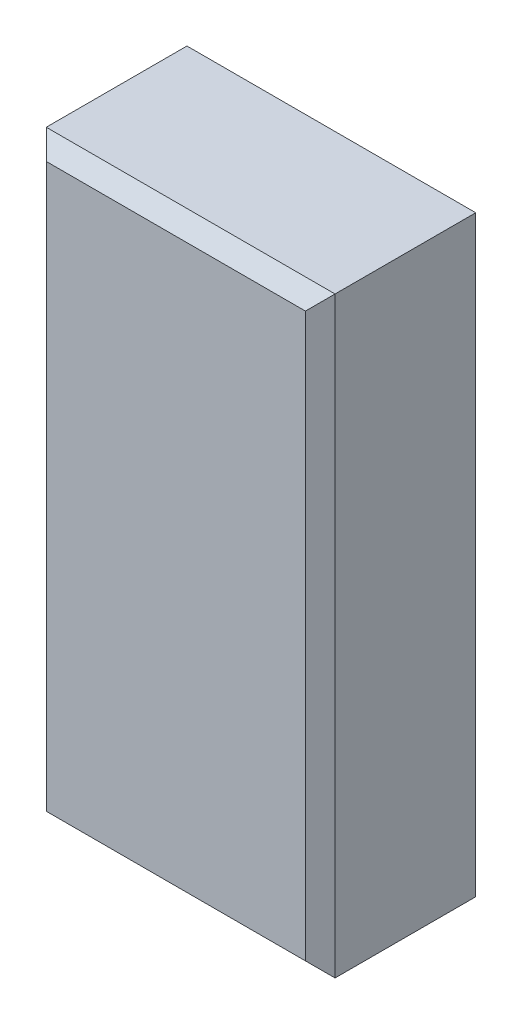
ISO-10303-21;
HEADER;
FILE_DESCRIPTION(('STEP AP214'),'2;1');
FILE_NAME('part.step','',(''),(''),'','','');
FILE_SCHEMA(('AUTOMOTIVE_DESIGN { 1 0 10303 214 1 1 1 1 }'));
ENDSEC;
DATA;
#1=APPLICATION_CONTEXT('core data for automotive mechanical design processes');
#2=APPLICATION_PROTOCOL_DEFINITION('international standard','automotive_design',2000,#1);
#3=PRODUCT_CONTEXT('',#1,'mechanical');
#4=PRODUCT('Part','Part','',(#3));
#5=PRODUCT_RELATED_PRODUCT_CATEGORY('part','',(#4));
#6=PRODUCT_DEFINITION_FORMATION('','',#4);
#7=PRODUCT_DEFINITION_CONTEXT('part definition',#1,'design');
#8=PRODUCT_DEFINITION('design','',#6,#7);
#9=PRODUCT_DEFINITION_SHAPE('','',#8);
#10=(LENGTH_UNIT() NAMED_UNIT(*) SI_UNIT(.MILLI.,.METRE.));
#11=(NAMED_UNIT(*) PLANE_ANGLE_UNIT() SI_UNIT($,.RADIAN.));
#12=(NAMED_UNIT(*) SI_UNIT($,.STERADIAN.) SOLID_ANGLE_UNIT());
#13=UNCERTAINTY_MEASURE_WITH_UNIT(LENGTH_MEASURE(1.E-05),#10,'distance_accuracy_value','');
#14=(GEOMETRIC_REPRESENTATION_CONTEXT(3) GLOBAL_UNCERTAINTY_ASSIGNED_CONTEXT((#13)) GLOBAL_UNIT_ASSIGNED_CONTEXT((#10,
#11,#12)) REPRESENTATION_CONTEXT('',''));
#15=CARTESIAN_POINT('',(0.,0.,0.));
#16=DIRECTION('',(0.,0.,1.));
#17=DIRECTION('',(1.,0.,0.));
#18=AXIS2_PLACEMENT_3D('',#15,#16,#17);
#19=CARTESIAN_POINT('',(9.75,20.,11.5));
#20=DIRECTION('',(-1.,0.,0.));
#21=DIRECTION('',(0.,-1.,0.));
#22=AXIS2_PLACEMENT_3D('',#19,#20,#21);
#23=PLANE('',#22);
#24=DIRECTION('',(0.,0.,-1.));
#25=VECTOR('',#24,1.);
#26=CARTESIAN_POINT('',(9.75000000000001,-20.,11.5));
#27=LINE('',#26,#25);
#28=CARTESIAN_POINT('',(9.75000000000001,-20.,10.5));
#29=VERTEX_POINT('',#28);
#30=CARTESIAN_POINT('',(9.75000000000001,-20.,1.00000000000001));
#31=VERTEX_POINT('',#30);
#32=EDGE_CURVE('E145',#29,#31,#27,.T.);
#33=ORIENTED_EDGE('',*,*,#32,.T.);
#34=DIRECTION('',(0.,1.,0.));
#35=VECTOR('',#34,1.);
#36=CARTESIAN_POINT('',(9.75,20.,1.00000000000001));
#37=LINE('',#36,#35);
#38=CARTESIAN_POINT('',(9.75,20.,1.00000000000001));
#39=VERTEX_POINT('',#38);
#40=EDGE_CURVE('E154',#31,#39,#37,.T.);
#41=ORIENTED_EDGE('',*,*,#40,.T.);
#42=DIRECTION('',(0.,0.,-1.));
#43=VECTOR('',#42,1.);
#44=CARTESIAN_POINT('',(9.75,20.,11.5));
#45=LINE('',#44,#43);
#46=CARTESIAN_POINT('',(9.75,20.,10.5));
#47=VERTEX_POINT('',#46);
#48=EDGE_CURVE('E123',#47,#39,#45,.T.);
#49=ORIENTED_EDGE('',*,*,#48,.F.);
#50=DIRECTION('',(0.,-1.,0.));
#51=VECTOR('',#50,1.);
#52=CARTESIAN_POINT('',(9.75000000000001,-20.,10.5));
#53=LINE('',#52,#51);
#54=EDGE_CURVE('E156',#47,#29,#53,.T.);
#55=ORIENTED_EDGE('',*,*,#54,.T.);
#56=EDGE_LOOP('',(#33,#41,#49,#55));
#57=FACE_BOUND('',#56,.T.);
#58=ADVANCED_FACE('F35',(#57),#23,.F.);
#59=CARTESIAN_POINT('',(-9.75,20.,11.5));
#60=DIRECTION('',(0.,-1.,0.));
#61=DIRECTION('',(0.,0.,-1.));
#62=AXIS2_PLACEMENT_3D('',#59,#60,#61);
#63=PLANE('',#62);
#64=ORIENTED_EDGE('',*,*,#48,.T.);
#65=DIRECTION('',(-1.,0.,0.));
#66=VECTOR('',#65,1.);
#67=CARTESIAN_POINT('',(-9.75,20.,1.00000000000001));
#68=LINE('',#67,#66);
#69=CARTESIAN_POINT('',(-9.75,20.,1.00000000000001));
#70=VERTEX_POINT('',#69);
#71=EDGE_CURVE('E122',#39,#70,#68,.T.);
#72=ORIENTED_EDGE('',*,*,#71,.T.);
#73=DIRECTION('',(0.,0.,-1.));
#74=VECTOR('',#73,1.);
#75=CARTESIAN_POINT('',(-9.75,20.,11.5));
#76=LINE('',#75,#74);
#77=CARTESIAN_POINT('',(-9.75,20.,10.5));
#78=VERTEX_POINT('',#77);
#79=EDGE_CURVE('E105',#78,#70,#76,.T.);
#80=ORIENTED_EDGE('',*,*,#79,.F.);
#81=DIRECTION('',(1.,0.,0.));
#82=VECTOR('',#81,1.);
#83=CARTESIAN_POINT('',(9.75,20.,10.5));
#84=LINE('',#83,#82);
#85=EDGE_CURVE('E119',#78,#47,#84,.T.);
#86=ORIENTED_EDGE('',*,*,#85,.T.);
#87=EDGE_LOOP('',(#64,#72,#80,#86));
#88=FACE_BOUND('',#87,.T.);
#89=ADVANCED_FACE('F118',(#88),#63,.F.);
#90=CARTESIAN_POINT('',(-9.75,20.,11.5));
#91=DIRECTION('',(1.,0.,0.));
#92=DIRECTION('',(0.,1.,0.));
#93=AXIS2_PLACEMENT_3D('',#90,#91,#92);
#94=PLANE('',#93);
#95=ORIENTED_EDGE('',*,*,#79,.T.);
#96=DIRECTION('',(0.,-1.,0.));
#97=VECTOR('',#96,1.);
#98=CARTESIAN_POINT('',(-9.75,20.,1.00000000000001));
#99=LINE('',#98,#97);
#100=CARTESIAN_POINT('',(-9.74999999999999,-20.,1.00000000000001));
#101=VERTEX_POINT('',#100);
#102=EDGE_CURVE('E111',#70,#101,#99,.T.);
#103=ORIENTED_EDGE('',*,*,#102,.T.);
#104=DIRECTION('',(0.,0.,-1.));
#105=VECTOR('',#104,1.);
#106=CARTESIAN_POINT('',(-9.74999999999999,-20.,11.5));
#107=LINE('',#106,#105);
#108=CARTESIAN_POINT('',(-9.74999999999999,-20.,10.5));
#109=VERTEX_POINT('',#108);
#110=EDGE_CURVE('E107',#109,#101,#107,.T.);
#111=ORIENTED_EDGE('',*,*,#110,.F.);
#112=DIRECTION('',(0.,1.,0.));
#113=VECTOR('',#112,1.);
#114=CARTESIAN_POINT('',(-9.75,20.,10.5));
#115=LINE('',#114,#113);
#116=EDGE_CURVE('E102',#109,#78,#115,.T.);
#117=ORIENTED_EDGE('',*,*,#116,.T.);
#118=EDGE_LOOP('',(#95,#103,#111,#117));
#119=FACE_BOUND('',#118,.T.);
#120=ADVANCED_FACE('F104',(#119),#94,.F.);
#121=CARTESIAN_POINT('',(-9.74999999999999,-20.,11.5));
#122=DIRECTION('',(0.,1.,0.));
#123=DIRECTION('',(0.,0.,1.));
#124=AXIS2_PLACEMENT_3D('',#121,#122,#123);
#125=PLANE('',#124);
#126=ORIENTED_EDGE('',*,*,#110,.T.);
#127=DIRECTION('',(1.,0.,0.));
#128=VECTOR('',#127,1.);
#129=CARTESIAN_POINT('',(-9.74999999999999,-20.,1.00000000000001));
#130=LINE('',#129,#128);
#131=EDGE_CURVE('E158',#101,#31,#130,.T.);
#132=ORIENTED_EDGE('',*,*,#131,.T.);
#133=ORIENTED_EDGE('',*,*,#32,.F.);
#134=DIRECTION('',(-1.,0.,0.));
#135=VECTOR('',#134,1.);
#136=CARTESIAN_POINT('',(-9.74999999999999,-20.,10.5));
#137=LINE('',#136,#135);
#138=EDGE_CURVE('E160',#29,#109,#137,.T.);
#139=ORIENTED_EDGE('',*,*,#138,.T.);
#140=EDGE_LOOP('',(#126,#132,#133,#139));
#141=FACE_BOUND('',#140,.T.);
#142=ADVANCED_FACE('F198',(#141),#125,.F.);
#143=CARTESIAN_POINT('',(0.,0.,11.5));
#144=DIRECTION('',(0.,0.,1.));
#145=DIRECTION('',(1.,0.,0.));
#146=AXIS2_PLACEMENT_3D('',#143,#144,#145);
#147=PLANE('',#146);
#148=DIRECTION('',(0.,-1.,0.));
#149=VECTOR('',#148,1.);
#150=CARTESIAN_POINT('',(-8.74999999999999,-20.,11.5));
#151=LINE('',#150,#149);
#152=CARTESIAN_POINT('',(-8.75,19.,11.5));
#153=VERTEX_POINT('',#152);
#154=CARTESIAN_POINT('',(-8.74999999999999,-19.,11.5));
#155=VERTEX_POINT('',#154);
#156=EDGE_CURVE('E45',#153,#155,#151,.T.);
#157=ORIENTED_EDGE('',*,*,#156,.T.);
#158=DIRECTION('',(1.,0.,0.));
#159=VECTOR('',#158,1.);
#160=CARTESIAN_POINT('',(9.75000000000001,-19.,11.5));
#161=LINE('',#160,#159);
#162=CARTESIAN_POINT('',(8.75000000000001,-19.,11.5));
#163=VERTEX_POINT('',#162);
#164=EDGE_CURVE('E11',#155,#163,#161,.T.);
#165=ORIENTED_EDGE('',*,*,#164,.T.);
#166=DIRECTION('',(0.,1.,0.));
#167=VECTOR('',#166,1.);
#168=CARTESIAN_POINT('',(8.75,20.,11.5));
#169=LINE('',#168,#167);
#170=CARTESIAN_POINT('',(8.75,19.,11.5));
#171=VERTEX_POINT('',#170);
#172=EDGE_CURVE('E152',#163,#171,#169,.T.);
#173=ORIENTED_EDGE('',*,*,#172,.T.);
#174=DIRECTION('',(-1.,0.,0.));
#175=VECTOR('',#174,1.);
#176=CARTESIAN_POINT('',(-9.75,19.,11.5));
#177=LINE('',#176,#175);
#178=EDGE_CURVE('E56',#171,#153,#177,.T.);
#179=ORIENTED_EDGE('',*,*,#178,.T.);
#180=EDGE_LOOP('',(#157,#165,#173,#179));
#181=FACE_BOUND('',#180,.T.);
#182=ADVANCED_FACE('F204',(#181),#147,.T.);
#183=CARTESIAN_POINT('',(0.,0.,0.));
#184=DIRECTION('',(0.,0.,1.));
#185=DIRECTION('',(1.,0.,0.));
#186=AXIS2_PLACEMENT_3D('',#183,#184,#185);
#187=PLANE('',#186);
#188=DIRECTION('',(0.,1.,0.));
#189=VECTOR('',#188,1.);
#190=CARTESIAN_POINT('',(-8.74999999999999,0.,0.));
#191=LINE('',#190,#189);
#192=CARTESIAN_POINT('',(-8.74999999999998,-19.,0.));
#193=VERTEX_POINT('',#192);
#194=CARTESIAN_POINT('',(-8.74999999999999,19.,0.));
#195=VERTEX_POINT('',#194);
#196=EDGE_CURVE('E165',#193,#195,#191,.T.);
#197=ORIENTED_EDGE('',*,*,#196,.T.);
#198=DIRECTION('',(1.,0.,0.));
#199=VECTOR('',#198,1.);
#200=CARTESIAN_POINT('',(0.,19.,0.));
#201=LINE('',#200,#199);
#202=CARTESIAN_POINT('',(8.74999999999999,19.,0.));
#203=VERTEX_POINT('',#202);
#204=EDGE_CURVE('E112',#195,#203,#201,.T.);
#205=ORIENTED_EDGE('',*,*,#204,.T.);
#206=DIRECTION('',(0.,-1.,0.));
#207=VECTOR('',#206,1.);
#208=CARTESIAN_POINT('',(8.75,0.,0.));
#209=LINE('',#208,#207);
#210=CARTESIAN_POINT('',(8.75,-19.,0.));
#211=VERTEX_POINT('',#210);
#212=EDGE_CURVE('E169',#203,#211,#209,.T.);
#213=ORIENTED_EDGE('',*,*,#212,.T.);
#214=DIRECTION('',(-1.,0.,0.));
#215=VECTOR('',#214,1.);
#216=CARTESIAN_POINT('',(0.,-19.,0.));
#217=LINE('',#216,#215);
#218=EDGE_CURVE('E167',#211,#193,#217,.T.);
#219=ORIENTED_EDGE('',*,*,#218,.T.);
#220=EDGE_LOOP('',(#197,#205,#213,#219));
#221=FACE_BOUND('',#220,.T.);
#222=ADVANCED_FACE('F206',(#221),#187,.F.);
#223=CARTESIAN_POINT('',(-9.74999999999999,-20.,1.00000000000001));
#224=DIRECTION('',(0.,0.707106781186547,0.707106781186547));
#225=DIRECTION('',(1.,0.,0.));
#226=AXIS2_PLACEMENT_3D('',#223,#224,#225);
#227=PLANE('',#226);
#228=DIRECTION('',(0.577350269189626,0.577350269189626,-0.577350269189626));
#229=VECTOR('',#228,1.);
#230=CARTESIAN_POINT('',(-9.74999999999999,-20.,1.00000000000001));
#231=LINE('',#230,#229);
#232=EDGE_CURVE('E146',#193,#101,#231,.F.);
#233=ORIENTED_EDGE('',*,*,#232,.F.);
#234=ORIENTED_EDGE('',*,*,#218,.F.);
#235=DIRECTION('',(-0.577350269189625,0.577350269189626,-0.577350269189626));
#236=VECTOR('',#235,1.);
#237=CARTESIAN_POINT('',(-3.58333333333333,-6.66666666666666,-12.3333333333333));
#238=LINE('',#237,#236);
#239=EDGE_CURVE('E142',#31,#211,#238,.T.);
#240=ORIENTED_EDGE('',*,*,#239,.F.);
#241=ORIENTED_EDGE('',*,*,#131,.F.);
#242=EDGE_LOOP('',(#233,#234,#240,#241));
#243=FACE_BOUND('',#242,.T.);
#244=ADVANCED_FACE('F185',(#243),#227,.F.);
#245=CARTESIAN_POINT('',(9.75,20.,1.00000000000001));
#246=DIRECTION('',(-0.707106781186548,0.,0.707106781186547));
#247=DIRECTION('',(0.,1.,0.));
#248=AXIS2_PLACEMENT_3D('',#245,#246,#247);
#249=PLANE('',#248);
#250=ORIENTED_EDGE('',*,*,#239,.T.);
#251=ORIENTED_EDGE('',*,*,#212,.F.);
#252=DIRECTION('',(0.577350269189625,0.577350269189626,0.577350269189626));
#253=VECTOR('',#252,1.);
#254=CARTESIAN_POINT('',(9.75,20.,1.00000000000001));
#255=LINE('',#254,#253);
#256=EDGE_CURVE('E133',#39,#203,#255,.F.);
#257=ORIENTED_EDGE('',*,*,#256,.F.);
#258=ORIENTED_EDGE('',*,*,#40,.F.);
#259=EDGE_LOOP('',(#250,#251,#257,#258));
#260=FACE_BOUND('',#259,.T.);
#261=ADVANCED_FACE('F189',(#260),#249,.F.);
#262=CARTESIAN_POINT('',(-9.75,20.,1.00000000000001));
#263=DIRECTION('',(0.707106781186547,0.,0.707106781186548));
#264=DIRECTION('',(0.,-1.,0.));
#265=AXIS2_PLACEMENT_3D('',#262,#263,#264);
#266=PLANE('',#265);
#267=ORIENTED_EDGE('',*,*,#232,.T.);
#268=ORIENTED_EDGE('',*,*,#102,.F.);
#269=DIRECTION('',(0.577350269189626,-0.577350269189626,-0.577350269189626));
#270=VECTOR('',#269,1.);
#271=CARTESIAN_POINT('',(-9.75,20.,1.00000000000001));
#272=LINE('',#271,#270);
#273=EDGE_CURVE('E132',#195,#70,#272,.F.);
#274=ORIENTED_EDGE('',*,*,#273,.F.);
#275=ORIENTED_EDGE('',*,*,#196,.F.);
#276=EDGE_LOOP('',(#267,#268,#274,#275));
#277=FACE_BOUND('',#276,.T.);
#278=ADVANCED_FACE('F197',(#277),#266,.F.);
#279=CARTESIAN_POINT('',(-9.75,20.,1.00000000000001));
#280=DIRECTION('',(0.,-0.707106781186547,0.707106781186547));
#281=DIRECTION('',(-1.,0.,0.));
#282=AXIS2_PLACEMENT_3D('',#279,#280,#281);
#283=PLANE('',#282);
#284=ORIENTED_EDGE('',*,*,#256,.T.);
#285=ORIENTED_EDGE('',*,*,#204,.F.);
#286=ORIENTED_EDGE('',*,*,#273,.T.);
#287=ORIENTED_EDGE('',*,*,#71,.F.);
#288=EDGE_LOOP('',(#284,#285,#286,#287));
#289=FACE_BOUND('',#288,.T.);
#290=ADVANCED_FACE('F192',(#289),#283,.F.);
#291=CARTESIAN_POINT('',(0.,19.,11.5));
#292=DIRECTION('',(0.,0.70710678118655,0.707106781186545));
#293=DIRECTION('',(1.,0.,0.));
#294=AXIS2_PLACEMENT_3D('',#291,#292,#293);
#295=PLANE('',#294);
#296=DIRECTION('',(-0.577350269189624,-0.577350269189625,0.577350269189629));
#297=VECTOR('',#296,1.);
#298=CARTESIAN_POINT('',(2.4166666666667,12.6666666666667,17.8333333333333));
#299=LINE('',#298,#297);
#300=EDGE_CURVE('E128',#47,#171,#299,.T.);
#301=ORIENTED_EDGE('',*,*,#300,.F.);
#302=ORIENTED_EDGE('',*,*,#85,.F.);
#303=DIRECTION('',(0.577350269189625,-0.577350269189624,0.577350269189628));
#304=VECTOR('',#303,1.);
#305=CARTESIAN_POINT('',(-5.83333333333334,16.0833333333333,14.4166666666667));
#306=LINE('',#305,#304);
#307=EDGE_CURVE('E40',#153,#78,#306,.F.);
#308=ORIENTED_EDGE('',*,*,#307,.F.);
#309=ORIENTED_EDGE('',*,*,#178,.F.);
#310=EDGE_LOOP('',(#301,#302,#308,#309));
#311=FACE_BOUND('',#310,.T.);
#312=ADVANCED_FACE('F38',(#311),#295,.T.);
#313=CARTESIAN_POINT('',(-8.74999999999999,0.,11.5));
#314=DIRECTION('',(-0.70710678118655,0.,0.707106781186545));
#315=DIRECTION('',(0.,1.,0.));
#316=AXIS2_PLACEMENT_3D('',#313,#314,#315);
#317=PLANE('',#316);
#318=ORIENTED_EDGE('',*,*,#307,.T.);
#319=ORIENTED_EDGE('',*,*,#116,.F.);
#320=DIRECTION('',(0.577350269189625,0.577350269189624,0.577350269189628));
#321=VECTOR('',#320,1.);
#322=CARTESIAN_POINT('',(-2.41666666666669,-12.6666666666667,17.8333333333333));
#323=LINE('',#322,#321);
#324=EDGE_CURVE('E135',#155,#109,#323,.F.);
#325=ORIENTED_EDGE('',*,*,#324,.F.);
#326=ORIENTED_EDGE('',*,*,#156,.F.);
#327=EDGE_LOOP('',(#318,#319,#325,#326));
#328=FACE_BOUND('',#327,.T.);
#329=ADVANCED_FACE('F131',(#328),#317,.T.);
#330=CARTESIAN_POINT('',(8.75,0.,11.5));
#331=DIRECTION('',(0.70710678118655,0.,0.707106781186545));
#332=DIRECTION('',(0.,-1.,0.));
#333=AXIS2_PLACEMENT_3D('',#330,#331,#332);
#334=PLANE('',#333);
#335=ORIENTED_EDGE('',*,*,#300,.T.);
#336=ORIENTED_EDGE('',*,*,#172,.F.);
#337=DIRECTION('',(0.577350269189624,-0.577350269189625,-0.577350269189629));
#338=VECTOR('',#337,1.);
#339=CARTESIAN_POINT('',(2.4166666666667,-12.6666666666667,17.8333333333333));
#340=LINE('',#339,#338);
#341=EDGE_CURVE('E138',#29,#163,#340,.F.);
#342=ORIENTED_EDGE('',*,*,#341,.F.);
#343=ORIENTED_EDGE('',*,*,#54,.F.);
#344=EDGE_LOOP('',(#335,#336,#342,#343));
#345=FACE_BOUND('',#344,.T.);
#346=ADVANCED_FACE('F203',(#345),#334,.T.);
#347=CARTESIAN_POINT('',(0.,-19.,11.5));
#348=DIRECTION('',(0.,-0.70710678118655,0.707106781186545));
#349=DIRECTION('',(-1.,0.,0.));
#350=AXIS2_PLACEMENT_3D('',#347,#348,#349);
#351=PLANE('',#350);
#352=ORIENTED_EDGE('',*,*,#324,.T.);
#353=ORIENTED_EDGE('',*,*,#138,.F.);
#354=ORIENTED_EDGE('',*,*,#341,.T.);
#355=ORIENTED_EDGE('',*,*,#164,.F.);
#356=EDGE_LOOP('',(#352,#353,#354,#355));
#357=FACE_BOUND('',#356,.T.);
#358=ADVANCED_FACE('F201',(#357),#351,.T.);
#359=CLOSED_SHELL('',(#58,#89,#120,#142,#182,#222,#244,#261,#278,#290,#312,#329,#346,#358));
#360=MANIFOLD_SOLID_BREP('B2',#359);
#361=ADVANCED_BREP_SHAPE_REPRESENTATION('',(#18,#360),#14);
#362=SHAPE_DEFINITION_REPRESENTATION(#9,#361);
ENDSEC;
END-ISO-10303-21;
